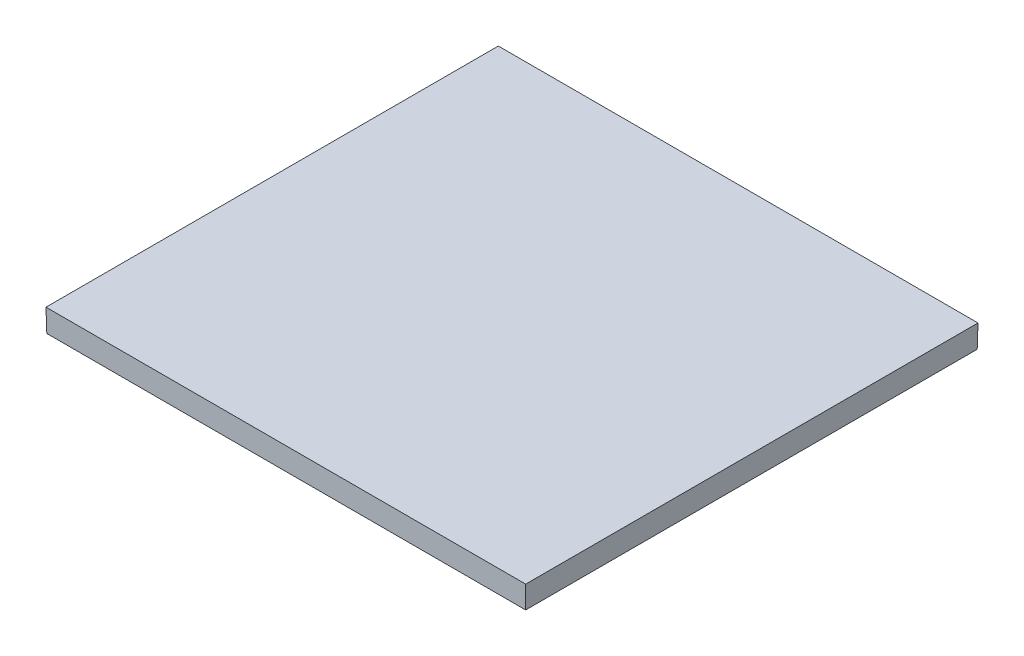
ISO-10303-21;
HEADER;
FILE_DESCRIPTION(('STEP AP214'),'2;1');
FILE_NAME('part.step','',(''),(''),'','','');
FILE_SCHEMA(('AUTOMOTIVE_DESIGN { 1 0 10303 214 1 1 1 1 }'));
ENDSEC;
DATA;
#1=APPLICATION_CONTEXT('core data for automotive mechanical design processes');
#2=APPLICATION_PROTOCOL_DEFINITION('international standard','automotive_design',2000,#1);
#3=PRODUCT_CONTEXT('',#1,'mechanical');
#4=PRODUCT('Part','Part','',(#3));
#5=PRODUCT_RELATED_PRODUCT_CATEGORY('part','',(#4));
#6=PRODUCT_DEFINITION_FORMATION('','',#4);
#7=PRODUCT_DEFINITION_CONTEXT('part definition',#1,'design');
#8=PRODUCT_DEFINITION('design','',#6,#7);
#9=PRODUCT_DEFINITION_SHAPE('','',#8);
#10=(LENGTH_UNIT() NAMED_UNIT(*) SI_UNIT(.MILLI.,.METRE.));
#11=(NAMED_UNIT(*) PLANE_ANGLE_UNIT() SI_UNIT($,.RADIAN.));
#12=(NAMED_UNIT(*) SI_UNIT($,.STERADIAN.) SOLID_ANGLE_UNIT());
#13=UNCERTAINTY_MEASURE_WITH_UNIT(LENGTH_MEASURE(1.E-05),#10,'distance_accuracy_value','');
#14=(GEOMETRIC_REPRESENTATION_CONTEXT(3) GLOBAL_UNCERTAINTY_ASSIGNED_CONTEXT((#13)) GLOBAL_UNIT_ASSIGNED_CONTEXT((#10,
#11,#12)) REPRESENTATION_CONTEXT('',''));
#15=CARTESIAN_POINT('',(0.,0.,0.));
#16=DIRECTION('',(0.,0.,1.));
#17=DIRECTION('',(1.,0.,0.));
#18=AXIS2_PLACEMENT_3D('',#15,#16,#17);
#19=CARTESIAN_POINT('',(105.,0.,99.));
#20=DIRECTION('',(0.999847695156391,-0.0174524064372835,0.));
#21=DIRECTION('',(0.0174524064372835,0.999847695156391,0.));
#22=AXIS2_PLACEMENT_3D('',#19,#20,#21);
#23=PLANE('',#22);
#24=DIRECTION('',(0.,0.,-1.));
#25=VECTOR('',#24,1.);
#26=CARTESIAN_POINT('',(105.,0.,99.));
#27=LINE('',#26,#25);
#28=CARTESIAN_POINT('',(105.,0.,99.));
#29=VERTEX_POINT('',#28);
#30=CARTESIAN_POINT('',(105.,0.,-99.));
#31=VERTEX_POINT('',#30);
#32=EDGE_CURVE('E83',#29,#31,#27,.T.);
#33=ORIENTED_EDGE('',*,*,#32,.T.);
#34=DIRECTION('',(-0.0174497491606827,-0.999695459881887,0.0174497491606827));
#35=VECTOR('',#34,1.);
#36=CARTESIAN_POINT('',(104.936056313388,-3.66333135252258,-98.9360563133881));
#37=LINE('',#36,#35);
#38=CARTESIAN_POINT('',(105.174550649282,10.,-99.1745506492822));
#39=VERTEX_POINT('',#38);
#40=EDGE_CURVE('E11',#39,#31,#37,.T.);
#41=ORIENTED_EDGE('',*,*,#40,.F.);
#42=DIRECTION('',(0.,0.,1.));
#43=VECTOR('',#42,1.);
#44=CARTESIAN_POINT('',(105.174550649282,10.,0.));
#45=LINE('',#44,#43);
#46=CARTESIAN_POINT('',(105.174550649282,10.,99.1745506492822));
#47=VERTEX_POINT('',#46);
#48=EDGE_CURVE('E99',#47,#39,#45,.F.);
#49=ORIENTED_EDGE('',*,*,#48,.F.);
#50=DIRECTION('',(-0.0174497491606827,-0.999695459881887,-0.0174497491606827));
#51=VECTOR('',#50,1.);
#52=CARTESIAN_POINT('',(105.,0.,99.));
#53=LINE('',#52,#51);
#54=EDGE_CURVE('E94',#47,#29,#53,.T.);
#55=ORIENTED_EDGE('',*,*,#54,.T.);
#56=EDGE_LOOP('',(#33,#41,#49,#55));
#57=FACE_BOUND('',#56,.T.);
#58=ADVANCED_FACE('F37',(#57),#23,.T.);
#59=CARTESIAN_POINT('',(-105.,0.,-99.));
#60=DIRECTION('',(0.,-0.0174524064372835,-0.999847695156391));
#61=DIRECTION('',(0.,0.999847695156391,-0.0174524064372835));
#62=AXIS2_PLACEMENT_3D('',#59,#60,#61);
#63=PLANE('',#62);
#64=DIRECTION('',(-1.,0.,0.));
#65=VECTOR('',#64,1.);
#66=CARTESIAN_POINT('',(-105.,0.,-99.));
#67=LINE('',#66,#65);
#68=CARTESIAN_POINT('',(-105.,0.,-99.));
#69=VERTEX_POINT('',#68);
#70=EDGE_CURVE('E79',#31,#69,#67,.T.);
#71=ORIENTED_EDGE('',*,*,#70,.T.);
#72=DIRECTION('',(0.0174497491606827,-0.999695459881887,0.0174497491606827));
#73=VECTOR('',#72,1.);
#74=CARTESIAN_POINT('',(-104.939710238337,-3.45399813237843,-98.9397102383374));
#75=LINE('',#74,#73);
#76=CARTESIAN_POINT('',(-105.174550649282,10.,-99.1745506492822));
#77=VERTEX_POINT('',#76);
#78=EDGE_CURVE('E46',#77,#69,#75,.T.);
#79=ORIENTED_EDGE('',*,*,#78,.F.);
#80=DIRECTION('',(1.,0.,0.));
#81=VECTOR('',#80,1.);
#82=CARTESIAN_POINT('',(0.,10.,-99.1745506492822));
#83=LINE('',#82,#81);
#84=EDGE_CURVE('E90',#39,#77,#83,.F.);
#85=ORIENTED_EDGE('',*,*,#84,.F.);
#86=ORIENTED_EDGE('',*,*,#40,.T.);
#87=EDGE_LOOP('',(#71,#79,#85,#86));
#88=FACE_BOUND('',#87,.T.);
#89=ADVANCED_FACE('F39',(#88),#63,.T.);
#90=CARTESIAN_POINT('',(-105.,0.,99.));
#91=DIRECTION('',(-0.999847695156391,-0.0174524064372835,0.));
#92=DIRECTION('',(0.0174524064372835,-0.999847695156391,0.));
#93=AXIS2_PLACEMENT_3D('',#90,#91,#92);
#94=PLANE('',#93);
#95=DIRECTION('',(0.,0.,1.));
#96=VECTOR('',#95,1.);
#97=CARTESIAN_POINT('',(-105.,0.,99.));
#98=LINE('',#97,#96);
#99=CARTESIAN_POINT('',(-105.,0.,99.));
#100=VERTEX_POINT('',#99);
#101=EDGE_CURVE('E84',#69,#100,#98,.T.);
#102=ORIENTED_EDGE('',*,*,#101,.T.);
#103=DIRECTION('',(0.0174497491606827,-0.999695459881887,-0.0174497491606827));
#104=VECTOR('',#103,1.);
#105=CARTESIAN_POINT('',(-105.,0.,99.));
#106=LINE('',#105,#104);
#107=CARTESIAN_POINT('',(-105.174550649282,10.,99.1745506492822));
#108=VERTEX_POINT('',#107);
#109=EDGE_CURVE('E102',#108,#100,#106,.T.);
#110=ORIENTED_EDGE('',*,*,#109,.F.);
#111=DIRECTION('',(0.,0.,-1.));
#112=VECTOR('',#111,1.);
#113=CARTESIAN_POINT('',(-105.174550649282,10.,0.));
#114=LINE('',#113,#112);
#115=EDGE_CURVE('E58',#77,#108,#114,.F.);
#116=ORIENTED_EDGE('',*,*,#115,.F.);
#117=ORIENTED_EDGE('',*,*,#78,.T.);
#118=EDGE_LOOP('',(#102,#110,#116,#117));
#119=FACE_BOUND('',#118,.T.);
#120=ADVANCED_FACE('F109',(#119),#94,.T.);
#121=CARTESIAN_POINT('',(-105.,0.,99.));
#122=DIRECTION('',(0.,-0.0174524064372835,0.999847695156391));
#123=DIRECTION('',(0.,-0.999847695156391,-0.0174524064372835));
#124=AXIS2_PLACEMENT_3D('',#121,#122,#123);
#125=PLANE('',#124);
#126=DIRECTION('',(1.,0.,0.));
#127=VECTOR('',#126,1.);
#128=CARTESIAN_POINT('',(-105.,0.,99.));
#129=LINE('',#128,#127);
#130=EDGE_CURVE('E98',#100,#29,#129,.T.);
#131=ORIENTED_EDGE('',*,*,#130,.T.);
#132=ORIENTED_EDGE('',*,*,#54,.F.);
#133=DIRECTION('',(-1.,0.,0.));
#134=VECTOR('',#133,1.);
#135=CARTESIAN_POINT('',(0.,10.,99.1745506492822));
#136=LINE('',#135,#134);
#137=EDGE_CURVE('E41',#108,#47,#136,.F.);
#138=ORIENTED_EDGE('',*,*,#137,.F.);
#139=ORIENTED_EDGE('',*,*,#109,.T.);
#140=EDGE_LOOP('',(#131,#132,#138,#139));
#141=FACE_BOUND('',#140,.T.);
#142=ADVANCED_FACE('F111',(#141),#125,.T.);
#143=CARTESIAN_POINT('',(0.,10.,0.));
#144=DIRECTION('',(0.,-1.,0.));
#145=DIRECTION('',(0.,0.,-1.));
#146=AXIS2_PLACEMENT_3D('',#143,#144,#145);
#147=PLANE('',#146);
#148=ORIENTED_EDGE('',*,*,#48,.T.);
#149=ORIENTED_EDGE('',*,*,#84,.T.);
#150=ORIENTED_EDGE('',*,*,#115,.T.);
#151=ORIENTED_EDGE('',*,*,#137,.T.);
#152=EDGE_LOOP('',(#148,#149,#150,#151));
#153=FACE_BOUND('',#152,.T.);
#154=ADVANCED_FACE('F107',(#153),#147,.F.);
#155=CARTESIAN_POINT('',(0.,0.,0.));
#156=DIRECTION('',(0.,-1.,0.));
#157=DIRECTION('',(0.,0.,-1.));
#158=AXIS2_PLACEMENT_3D('',#155,#156,#157);
#159=PLANE('',#158);
#160=ORIENTED_EDGE('',*,*,#32,.F.);
#161=ORIENTED_EDGE('',*,*,#130,.F.);
#162=ORIENTED_EDGE('',*,*,#101,.F.);
#163=ORIENTED_EDGE('',*,*,#70,.F.);
#164=EDGE_LOOP('',(#160,#161,#162,#163));
#165=FACE_BOUND('',#164,.T.);
#166=ADVANCED_FACE('F80',(#165),#159,.T.);
#167=CLOSED_SHELL('',(#58,#89,#120,#142,#154,#166));
#168=MANIFOLD_SOLID_BREP('B2',#167);
#169=ADVANCED_BREP_SHAPE_REPRESENTATION('',(#18,#168),#14);
#170=SHAPE_DEFINITION_REPRESENTATION(#9,#169);
ENDSEC;
END-ISO-10303-21;
